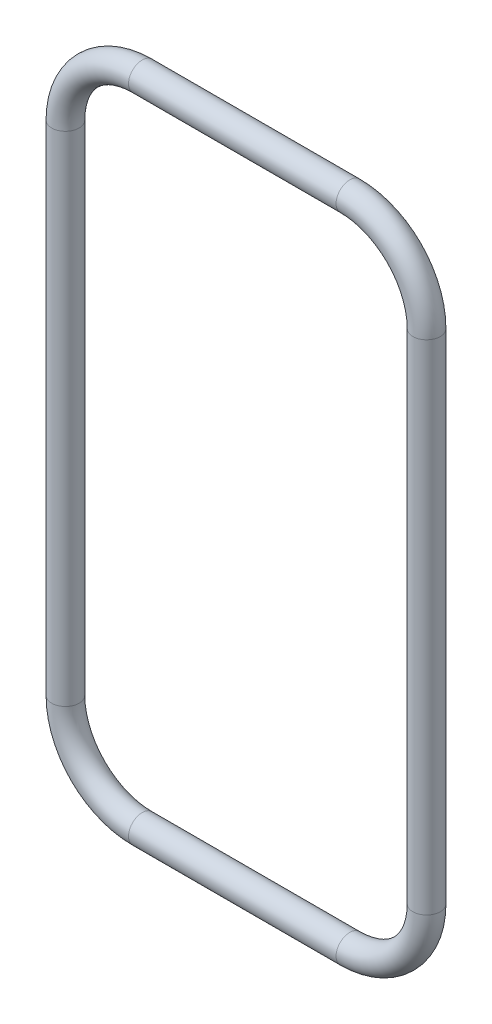
ISO-10303-21;
HEADER;
FILE_DESCRIPTION(('STEP AP214'),'2;1');
FILE_NAME('part.step','',(''),(''),'','','');
FILE_SCHEMA(('AUTOMOTIVE_DESIGN { 1 0 10303 214 1 1 1 1 }'));
ENDSEC;
DATA;
#1=APPLICATION_CONTEXT('core data for automotive mechanical design processes');
#2=APPLICATION_PROTOCOL_DEFINITION('international standard','automotive_design',2000,#1);
#3=PRODUCT_CONTEXT('',#1,'mechanical');
#4=PRODUCT('Part','Part','',(#3));
#5=PRODUCT_RELATED_PRODUCT_CATEGORY('part','',(#4));
#6=PRODUCT_DEFINITION_FORMATION('','',#4);
#7=PRODUCT_DEFINITION_CONTEXT('part definition',#1,'design');
#8=PRODUCT_DEFINITION('design','',#6,#7);
#9=PRODUCT_DEFINITION_SHAPE('','',#8);
#10=(LENGTH_UNIT() NAMED_UNIT(*) SI_UNIT(.MILLI.,.METRE.));
#11=(NAMED_UNIT(*) PLANE_ANGLE_UNIT() SI_UNIT($,.RADIAN.));
#12=(NAMED_UNIT(*) SI_UNIT($,.STERADIAN.) SOLID_ANGLE_UNIT());
#13=UNCERTAINTY_MEASURE_WITH_UNIT(LENGTH_MEASURE(1.E-05),#10,'distance_accuracy_value','');
#14=(GEOMETRIC_REPRESENTATION_CONTEXT(3) GLOBAL_UNCERTAINTY_ASSIGNED_CONTEXT((#13)) GLOBAL_UNIT_ASSIGNED_CONTEXT((#10,
#11,#12)) REPRESENTATION_CONTEXT('',''));
#15=CARTESIAN_POINT('',(0.,0.,0.));
#16=DIRECTION('',(0.,0.,1.));
#17=DIRECTION('',(1.,0.,0.));
#18=AXIS2_PLACEMENT_3D('',#15,#16,#17);
#19=CARTESIAN_POINT('',(34.99993,19.99996,0.));
#20=DIRECTION('',(0.,0.,-1.));
#21=DIRECTION('',(-1.,0.,0.));
#22=AXIS2_PLACEMENT_3D('',#19,#20,#21);
#23=TOROIDAL_SURFACE('',#22,9.249978,1.65);
#24=CARTESIAN_POINT('',(34.99993,10.749982,0.));
#25=DIRECTION('',(1.,0.,0.));
#26=DIRECTION('',(0.,1.,0.));
#27=AXIS2_PLACEMENT_3D('',#24,#25,#26);
#28=CIRCLE('',#27,1.65);
#29=CARTESIAN_POINT('',(34.99993,9.099982,0.));
#30=VERTEX_POINT('',#29);
#31=EDGE_CURVE('E95',#30,#30,#28,.T.);
#32=CARTESIAN_POINT('',(25.749952,19.99996,0.));
#33=DIRECTION('',(0.,-1.,0.));
#34=DIRECTION('',(1.,0.,0.));
#35=AXIS2_PLACEMENT_3D('',#32,#33,#34);
#36=CIRCLE('',#35,1.65);
#37=CARTESIAN_POINT('',(24.099952,19.99996,0.));
#38=VERTEX_POINT('',#37);
#39=EDGE_CURVE('E91',#38,#38,#36,.T.);
#40=CARTESIAN_POINT('',(34.99993,19.99996,0.));
#41=DIRECTION('',(0.,0.,-1.));
#42=DIRECTION('',(-1.,0.,0.));
#43=AXIS2_PLACEMENT_3D('',#40,#41,#42);
#44=CIRCLE('',#43,10.899978);
#45=EDGE_CURVE('',#30,#38,#44,.T.);
#46=ORIENTED_EDGE('',*,*,#31,.F.);
#47=ORIENTED_EDGE('',*,*,#39,.T.);
#48=ORIENTED_EDGE('',*,*,#45,.T.);
#49=ORIENTED_EDGE('',*,*,#45,.F.);
#50=EDGE_LOOP('',(#46,#48,#47,#49));
#51=FACE_BOUND('',#50,.T.);
#52=ADVANCED_FACE('F59',(#51),#23,.T.);
#53=CARTESIAN_POINT('',(25.749952,19.99996,0.));
#54=DIRECTION('',(0.,1.,0.));
#55=DIRECTION('',(-1.,0.,0.));
#56=AXIS2_PLACEMENT_3D('',#53,#54,#55);
#57=CYLINDRICAL_SURFACE('',#56,1.65);
#58=CARTESIAN_POINT('',(25.749952,79.99984,0.));
#59=DIRECTION('',(0.,-1.,0.));
#60=DIRECTION('',(1.,0.,0.));
#61=AXIS2_PLACEMENT_3D('',#58,#59,#60);
#62=CIRCLE('',#61,1.65);
#63=CARTESIAN_POINT('',(24.099952,79.99984,0.));
#64=VERTEX_POINT('',#63);
#65=EDGE_CURVE('E87',#64,#64,#62,.T.);
#66=ORIENTED_EDGE('',*,*,#65,.T.);
#67=EDGE_LOOP('',(#66));
#68=FACE_BOUND('',#67,.T.);
#69=ORIENTED_EDGE('',*,*,#39,.F.);
#70=EDGE_LOOP('',(#69));
#71=FACE_BOUND('',#70,.T.);
#72=ADVANCED_FACE('F103',(#68,#71),#57,.T.);
#73=CARTESIAN_POINT('',(34.99993,79.99984,0.));
#74=DIRECTION('',(0.,0.,-1.));
#75=DIRECTION('',(-1.,0.,0.));
#76=AXIS2_PLACEMENT_3D('',#73,#74,#75);
#77=TOROIDAL_SURFACE('',#76,9.249978,1.65);
#78=CARTESIAN_POINT('',(34.99993,89.249818,0.));
#79=DIRECTION('',(-1.,0.,0.));
#80=DIRECTION('',(0.,-1.,0.));
#81=AXIS2_PLACEMENT_3D('',#78,#79,#80);
#82=CIRCLE('',#81,1.65);
#83=CARTESIAN_POINT('',(34.99993,90.899818,0.));
#84=VERTEX_POINT('',#83);
#85=EDGE_CURVE('E83',#84,#84,#82,.T.);
#86=CARTESIAN_POINT('',(34.99993,79.99984,0.));
#87=DIRECTION('',(0.,0.,-1.));
#88=DIRECTION('',(-1.,0.,0.));
#89=AXIS2_PLACEMENT_3D('',#86,#87,#88);
#90=CIRCLE('',#89,10.899978);
#91=EDGE_CURVE('',#64,#84,#90,.T.);
#92=ORIENTED_EDGE('',*,*,#65,.F.);
#93=ORIENTED_EDGE('',*,*,#85,.T.);
#94=ORIENTED_EDGE('',*,*,#91,.T.);
#95=ORIENTED_EDGE('',*,*,#91,.F.);
#96=EDGE_LOOP('',(#92,#94,#93,#95));
#97=FACE_BOUND('',#96,.T.);
#98=ADVANCED_FACE('F109',(#97),#77,.T.);
#99=CARTESIAN_POINT('',(34.99993,89.249818,0.));
#100=DIRECTION('',(1.,0.,0.));
#101=DIRECTION('',(0.,0.,-1.));
#102=AXIS2_PLACEMENT_3D('',#99,#100,#101);
#103=CYLINDRICAL_SURFACE('',#102,1.65);
#104=CARTESIAN_POINT('',(59.9998799999999,89.249818,0.));
#105=DIRECTION('',(-1.,0.,0.));
#106=DIRECTION('',(0.,-1.,0.));
#107=AXIS2_PLACEMENT_3D('',#104,#105,#106);
#108=CIRCLE('',#107,1.65);
#109=CARTESIAN_POINT('',(59.9998799999999,90.899818,0.));
#110=VERTEX_POINT('',#109);
#111=EDGE_CURVE('E77',#110,#110,#108,.T.);
#112=ORIENTED_EDGE('',*,*,#111,.T.);
#113=EDGE_LOOP('',(#112));
#114=FACE_BOUND('',#113,.T.);
#115=ORIENTED_EDGE('',*,*,#85,.F.);
#116=EDGE_LOOP('',(#115));
#117=FACE_BOUND('',#116,.T.);
#118=ADVANCED_FACE('F115',(#114,#117),#103,.T.);
#119=CARTESIAN_POINT('',(59.9998799999999,79.99984,0.));
#120=DIRECTION('',(0.,0.,-1.));
#121=DIRECTION('',(-1.,0.,0.));
#122=AXIS2_PLACEMENT_3D('',#119,#120,#121);
#123=TOROIDAL_SURFACE('',#122,9.24997800000001,1.65);
#124=CARTESIAN_POINT('',(69.2498579999999,79.99984,0.));
#125=DIRECTION('',(0.,1.,0.));
#126=DIRECTION('',(-1.,0.,0.));
#127=AXIS2_PLACEMENT_3D('',#124,#125,#126);
#128=CIRCLE('',#127,1.65);
#129=CARTESIAN_POINT('',(70.899858,79.99984,0.));
#130=VERTEX_POINT('',#129);
#131=EDGE_CURVE('E72',#130,#130,#128,.T.);
#132=CARTESIAN_POINT('',(59.9998799999999,79.99984,0.));
#133=DIRECTION('',(0.,0.,-1.));
#134=DIRECTION('',(-1.,0.,0.));
#135=AXIS2_PLACEMENT_3D('',#132,#133,#134);
#136=CIRCLE('',#135,10.899978);
#137=EDGE_CURVE('',#110,#130,#136,.T.);
#138=ORIENTED_EDGE('',*,*,#111,.F.);
#139=ORIENTED_EDGE('',*,*,#131,.T.);
#140=ORIENTED_EDGE('',*,*,#137,.T.);
#141=ORIENTED_EDGE('',*,*,#137,.F.);
#142=EDGE_LOOP('',(#138,#140,#139,#141));
#143=FACE_BOUND('',#142,.T.);
#144=ADVANCED_FACE('F119',(#143),#123,.T.);
#145=CARTESIAN_POINT('',(69.2498579999999,79.99984,0.));
#146=DIRECTION('',(0.,-1.,0.));
#147=DIRECTION('',(1.,0.,0.));
#148=AXIS2_PLACEMENT_3D('',#145,#146,#147);
#149=CYLINDRICAL_SURFACE('',#148,1.65);
#150=CARTESIAN_POINT('',(69.249858,19.99996,0.));
#151=DIRECTION('',(0.,1.,0.));
#152=DIRECTION('',(-1.,0.,0.));
#153=AXIS2_PLACEMENT_3D('',#150,#151,#152);
#154=CIRCLE('',#153,1.65);
#155=CARTESIAN_POINT('',(70.899858,19.99996,0.));
#156=VERTEX_POINT('',#155);
#157=EDGE_CURVE('E67',#156,#156,#154,.T.);
#158=ORIENTED_EDGE('',*,*,#157,.T.);
#159=EDGE_LOOP('',(#158));
#160=FACE_BOUND('',#159,.T.);
#161=ORIENTED_EDGE('',*,*,#131,.F.);
#162=EDGE_LOOP('',(#161));
#163=FACE_BOUND('',#162,.T.);
#164=ADVANCED_FACE('F123',(#160,#163),#149,.T.);
#165=CARTESIAN_POINT('',(59.99988,19.99996,0.));
#166=DIRECTION('',(0.,0.,-1.));
#167=DIRECTION('',(-1.,0.,0.));
#168=AXIS2_PLACEMENT_3D('',#165,#166,#167);
#169=TOROIDAL_SURFACE('',#168,9.24997800000001,1.65);
#170=CARTESIAN_POINT('',(59.99988,10.749982,0.));
#171=DIRECTION('',(1.,0.,0.));
#172=DIRECTION('',(0.,1.,0.));
#173=AXIS2_PLACEMENT_3D('',#170,#171,#172);
#174=CIRCLE('',#173,1.65);
#175=CARTESIAN_POINT('',(59.99988,9.09998200000001,0.));
#176=VERTEX_POINT('',#175);
#177=EDGE_CURVE('E11',#176,#176,#174,.T.);
#178=CARTESIAN_POINT('',(59.99988,19.99996,0.));
#179=DIRECTION('',(0.,0.,-1.));
#180=DIRECTION('',(-1.,0.,0.));
#181=AXIS2_PLACEMENT_3D('',#178,#179,#180);
#182=CIRCLE('',#181,10.899978);
#183=EDGE_CURVE('',#156,#176,#182,.T.);
#184=ORIENTED_EDGE('',*,*,#157,.F.);
#185=ORIENTED_EDGE('',*,*,#177,.T.);
#186=ORIENTED_EDGE('',*,*,#183,.T.);
#187=ORIENTED_EDGE('',*,*,#183,.F.);
#188=EDGE_LOOP('',(#184,#186,#185,#187));
#189=FACE_BOUND('',#188,.T.);
#190=ADVANCED_FACE('F126',(#189),#169,.T.);
#191=CARTESIAN_POINT('',(59.99988,10.7499820000001,0.));
#192=DIRECTION('',(-1.,0.,0.));
#193=DIRECTION('',(0.,-1.,0.));
#194=AXIS2_PLACEMENT_3D('',#191,#192,#193);
#195=CYLINDRICAL_SURFACE('',#194,1.65);
#196=ORIENTED_EDGE('',*,*,#31,.T.);
#197=EDGE_LOOP('',(#196));
#198=FACE_BOUND('',#197,.T.);
#199=ORIENTED_EDGE('',*,*,#177,.F.);
#200=EDGE_LOOP('',(#199));
#201=FACE_BOUND('',#200,.T.);
#202=ADVANCED_FACE('F61',(#198,#201),#195,.T.);
#203=CLOSED_SHELL('',(#52,#72,#98,#118,#144,#164,#190,#202));
#204=MANIFOLD_SOLID_BREP('B2',#203);
#205=ADVANCED_BREP_SHAPE_REPRESENTATION('',(#18,#204),#14);
#206=SHAPE_DEFINITION_REPRESENTATION(#9,#205);
ENDSEC;
END-ISO-10303-21;
